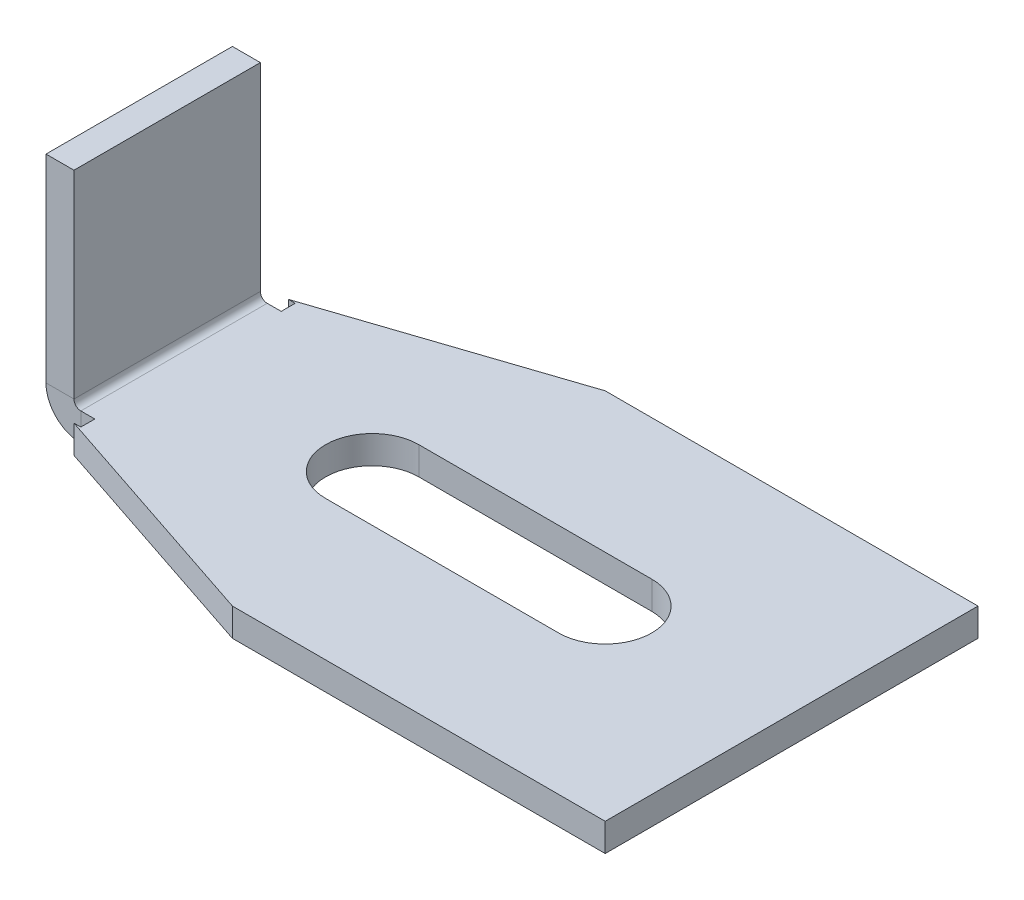
ISO-10303-21;
HEADER;
FILE_DESCRIPTION(('STEP AP214'),'2;1');
FILE_NAME('part.step','',(''),(''),'','','');
FILE_SCHEMA(('AUTOMOTIVE_DESIGN { 1 0 10303 214 1 1 1 1 }'));
ENDSEC;
DATA;
#1=APPLICATION_CONTEXT('core data for automotive mechanical design processes');
#2=APPLICATION_PROTOCOL_DEFINITION('international standard','automotive_design',2000,#1);
#3=PRODUCT_CONTEXT('',#1,'mechanical');
#4=PRODUCT('Part','Part','',(#3));
#5=PRODUCT_RELATED_PRODUCT_CATEGORY('part','',(#4));
#6=PRODUCT_DEFINITION_FORMATION('','',#4);
#7=PRODUCT_DEFINITION_CONTEXT('part definition',#1,'design');
#8=PRODUCT_DEFINITION('design','',#6,#7);
#9=PRODUCT_DEFINITION_SHAPE('','',#8);
#10=(LENGTH_UNIT() NAMED_UNIT(*) SI_UNIT(.MILLI.,.METRE.));
#11=(NAMED_UNIT(*) PLANE_ANGLE_UNIT() SI_UNIT($,.RADIAN.));
#12=(NAMED_UNIT(*) SI_UNIT($,.STERADIAN.) SOLID_ANGLE_UNIT());
#13=UNCERTAINTY_MEASURE_WITH_UNIT(LENGTH_MEASURE(1.E-05),#10,'distance_accuracy_value','');
#14=(GEOMETRIC_REPRESENTATION_CONTEXT(3) GLOBAL_UNCERTAINTY_ASSIGNED_CONTEXT((#13)) GLOBAL_UNIT_ASSIGNED_CONTEXT((#10,
#11,#12)) REPRESENTATION_CONTEXT('',''));
#15=CARTESIAN_POINT('',(0.,0.,0.));
#16=DIRECTION('',(0.,0.,1.));
#17=DIRECTION('',(1.,0.,0.));
#18=AXIS2_PLACEMENT_3D('',#15,#16,#17);
#19=CARTESIAN_POINT('',(30.,-3.,-20.));
#20=DIRECTION('',(-0.316227766016838,0.,-0.948683298050514));
#21=DIRECTION('',(-0.948683298050514,0.,0.316227766016838));
#22=AXIS2_PLACEMENT_3D('',#19,#20,#21);
#23=PLANE('',#22);
#24=DIRECTION('',(-0.948683298050514,0.,0.316227766016838));
#25=VECTOR('',#24,1.);
#26=CARTESIAN_POINT('',(30.,-3.,-20.));
#27=LINE('',#26,#25);
#28=CARTESIAN_POINT('',(30.,-3.,-20.));
#29=VERTEX_POINT('',#28);
#30=CARTESIAN_POINT('',(4.50000000000001,-3.,-11.5));
#31=VERTEX_POINT('',#30);
#32=EDGE_CURVE('E344',#29,#31,#27,.T.);
#33=ORIENTED_EDGE('',*,*,#32,.T.);
#34=DIRECTION('',(0.,-1.,0.));
#35=VECTOR('',#34,1.);
#36=CARTESIAN_POINT('',(4.50000000000001,0.,-11.5));
#37=LINE('',#36,#35);
#38=CARTESIAN_POINT('',(4.50000000000001,0.,-11.5));
#39=VERTEX_POINT('',#38);
#40=EDGE_CURVE('E308',#39,#31,#37,.T.);
#41=ORIENTED_EDGE('',*,*,#40,.F.);
#42=DIRECTION('',(-0.948683298050514,0.,0.316227766016838));
#43=VECTOR('',#42,1.);
#44=CARTESIAN_POINT('',(30.,0.,-20.));
#45=LINE('',#44,#43);
#46=CARTESIAN_POINT('',(30.,0.,-20.));
#47=VERTEX_POINT('',#46);
#48=EDGE_CURVE('E336',#47,#39,#45,.T.);
#49=ORIENTED_EDGE('',*,*,#48,.F.);
#50=DIRECTION('',(0.,1.,0.));
#51=VECTOR('',#50,1.);
#52=CARTESIAN_POINT('',(30.,-3.,-20.));
#53=LINE('',#52,#51);
#54=EDGE_CURVE('E13',#29,#47,#53,.T.);
#55=ORIENTED_EDGE('',*,*,#54,.F.);
#56=EDGE_LOOP('',(#33,#41,#49,#55));
#57=FACE_BOUND('',#56,.T.);
#58=ADVANCED_FACE('F58',(#57),#23,.T.);
#59=CARTESIAN_POINT('',(30.,-3.,20.));
#60=DIRECTION('',(-0.316227766016838,0.,0.948683298050514));
#61=DIRECTION('',(0.948683298050514,0.,0.316227766016838));
#62=AXIS2_PLACEMENT_3D('',#59,#60,#61);
#63=PLANE('',#62);
#64=DIRECTION('',(0.948683298050514,0.,0.316227766016838));
#65=VECTOR('',#64,1.);
#66=CARTESIAN_POINT('',(30.,0.,20.));
#67=LINE('',#66,#65);
#68=CARTESIAN_POINT('',(4.5,0.,11.5));
#69=VERTEX_POINT('',#68);
#70=CARTESIAN_POINT('',(30.,0.,20.));
#71=VERTEX_POINT('',#70);
#72=EDGE_CURVE('E332',#69,#71,#67,.T.);
#73=ORIENTED_EDGE('',*,*,#72,.F.);
#74=DIRECTION('',(0.,-1.,0.));
#75=VECTOR('',#74,1.);
#76=CARTESIAN_POINT('',(4.5,0.,11.5));
#77=LINE('',#76,#75);
#78=CARTESIAN_POINT('',(4.5,-3.,11.5));
#79=VERTEX_POINT('',#78);
#80=EDGE_CURVE('E289',#69,#79,#77,.T.);
#81=ORIENTED_EDGE('',*,*,#80,.T.);
#82=DIRECTION('',(0.948683298050514,0.,0.316227766016838));
#83=VECTOR('',#82,1.);
#84=CARTESIAN_POINT('',(30.,-3.,20.));
#85=LINE('',#84,#83);
#86=CARTESIAN_POINT('',(30.,-3.,20.));
#87=VERTEX_POINT('',#86);
#88=EDGE_CURVE('E333',#79,#87,#85,.T.);
#89=ORIENTED_EDGE('',*,*,#88,.T.);
#90=DIRECTION('',(0.,1.,0.));
#91=VECTOR('',#90,1.);
#92=CARTESIAN_POINT('',(30.,-3.,20.));
#93=LINE('',#92,#91);
#94=EDGE_CURVE('E62',#87,#71,#93,.T.);
#95=ORIENTED_EDGE('',*,*,#94,.T.);
#96=EDGE_LOOP('',(#73,#81,#89,#95));
#97=FACE_BOUND('',#96,.T.);
#98=ADVANCED_FACE('F60',(#97),#63,.T.);
#99=CARTESIAN_POINT('',(0.,-3.,0.));
#100=DIRECTION('',(0.,-1.,0.));
#101=DIRECTION('',(0.,0.,-1.));
#102=AXIS2_PLACEMENT_3D('',#99,#100,#101);
#103=PLANE('',#102);
#104=CARTESIAN_POINT('',(50.,-3.,0.));
#105=DIRECTION('',(0.,-1.,0.));
#106=DIRECTION('',(0.,0.,-1.));
#107=AXIS2_PLACEMENT_3D('',#104,#105,#106);
#108=CIRCLE('',#107,5.);
#109=CARTESIAN_POINT('',(50.,-3.,-5.));
#110=VERTEX_POINT('',#109);
#111=CARTESIAN_POINT('',(50.,-3.,5.));
#112=VERTEX_POINT('',#111);
#113=EDGE_CURVE('E229',#110,#112,#108,.T.);
#114=ORIENTED_EDGE('',*,*,#113,.F.);
#115=DIRECTION('',(1.,0.,0.));
#116=VECTOR('',#115,1.);
#117=CARTESIAN_POINT('',(0.,-3.,-5.));
#118=LINE('',#117,#116);
#119=CARTESIAN_POINT('',(25.,-3.,-5.));
#120=VERTEX_POINT('',#119);
#121=EDGE_CURVE('E222',#120,#110,#118,.T.);
#122=ORIENTED_EDGE('',*,*,#121,.F.);
#123=CARTESIAN_POINT('',(25.,-3.,0.));
#124=DIRECTION('',(0.,-1.,0.));
#125=DIRECTION('',(0.,0.,-1.));
#126=AXIS2_PLACEMENT_3D('',#123,#124,#125);
#127=CIRCLE('',#126,5.);
#128=CARTESIAN_POINT('',(25.,-3.,5.));
#129=VERTEX_POINT('',#128);
#130=EDGE_CURVE('E202',#129,#120,#127,.T.);
#131=ORIENTED_EDGE('',*,*,#130,.F.);
#132=DIRECTION('',(-1.,0.,0.));
#133=VECTOR('',#132,1.);
#134=CARTESIAN_POINT('',(0.,-3.,5.00000000000001));
#135=LINE('',#134,#133);
#136=EDGE_CURVE('E227',#112,#129,#135,.T.);
#137=ORIENTED_EDGE('',*,*,#136,.F.);
#138=EDGE_LOOP('',(#114,#122,#131,#137));
#139=FACE_BOUND('',#138,.T.);
#140=ORIENTED_EDGE('',*,*,#88,.F.);
#141=DIRECTION('',(1.,0.,0.));
#142=VECTOR('',#141,1.);
#143=CARTESIAN_POINT('',(0.,-3.,11.5));
#144=LINE('',#143,#142);
#145=CARTESIAN_POINT('',(5.2366,-3.,11.5));
#146=VERTEX_POINT('',#145);
#147=EDGE_CURVE('E330',#79,#146,#144,.T.);
#148=ORIENTED_EDGE('',*,*,#147,.T.);
#149=DIRECTION('',(0.,0.,-1.));
#150=VECTOR('',#149,1.);
#151=CARTESIAN_POINT('',(5.2366,-3.,0.));
#152=LINE('',#151,#150);
#153=CARTESIAN_POINT('',(5.2366,-3.,10.));
#154=VERTEX_POINT('',#153);
#155=EDGE_CURVE('E328',#146,#154,#152,.T.);
#156=ORIENTED_EDGE('',*,*,#155,.T.);
#157=DIRECTION('',(-1.,0.,0.));
#158=VECTOR('',#157,1.);
#159=CARTESIAN_POINT('',(0.,-3.,10.));
#160=LINE('',#159,#158);
#161=CARTESIAN_POINT('',(3.7366,-3.,10.));
#162=VERTEX_POINT('',#161);
#163=EDGE_CURVE('E325',#154,#162,#160,.T.);
#164=ORIENTED_EDGE('',*,*,#163,.T.);
#165=DIRECTION('',(0.,0.,1.));
#166=VECTOR('',#165,1.);
#167=CARTESIAN_POINT('',(3.7366,-3.,10.));
#168=LINE('',#167,#166);
#169=CARTESIAN_POINT('',(3.7366,-3.,-10.));
#170=VERTEX_POINT('',#169);
#171=EDGE_CURVE('E262',#162,#170,#168,.F.);
#172=ORIENTED_EDGE('',*,*,#171,.T.);
#173=DIRECTION('',(1.,0.,0.));
#174=VECTOR('',#173,1.);
#175=CARTESIAN_POINT('',(0.,-3.,-10.));
#176=LINE('',#175,#174);
#177=CARTESIAN_POINT('',(5.2366,-3.,-10.));
#178=VERTEX_POINT('',#177);
#179=EDGE_CURVE('E323',#170,#178,#176,.T.);
#180=ORIENTED_EDGE('',*,*,#179,.T.);
#181=DIRECTION('',(0.,0.,-1.));
#182=VECTOR('',#181,1.);
#183=CARTESIAN_POINT('',(5.2366,-3.,0.));
#184=LINE('',#183,#182);
#185=CARTESIAN_POINT('',(5.2366,-3.,-11.5));
#186=VERTEX_POINT('',#185);
#187=EDGE_CURVE('E321',#178,#186,#184,.T.);
#188=ORIENTED_EDGE('',*,*,#187,.T.);
#189=DIRECTION('',(-1.,0.,0.));
#190=VECTOR('',#189,1.);
#191=CARTESIAN_POINT('',(0.,-3.,-11.5));
#192=LINE('',#191,#190);
#193=EDGE_CURVE('E288',#186,#31,#192,.T.);
#194=ORIENTED_EDGE('',*,*,#193,.T.);
#195=ORIENTED_EDGE('',*,*,#32,.F.);
#196=DIRECTION('',(-1.,0.,0.));
#197=VECTOR('',#196,1.);
#198=CARTESIAN_POINT('',(70.,-3.,-20.));
#199=LINE('',#198,#197);
#200=CARTESIAN_POINT('',(70.,-3.,-20.));
#201=VERTEX_POINT('',#200);
#202=EDGE_CURVE('E341',#201,#29,#199,.T.);
#203=ORIENTED_EDGE('',*,*,#202,.F.);
#204=DIRECTION('',(0.,0.,-1.));
#205=VECTOR('',#204,1.);
#206=CARTESIAN_POINT('',(70.,-3.,0.));
#207=LINE('',#206,#205);
#208=CARTESIAN_POINT('',(70.,-3.,20.));
#209=VERTEX_POINT('',#208);
#210=EDGE_CURVE('E339',#209,#201,#207,.T.);
#211=ORIENTED_EDGE('',*,*,#210,.F.);
#212=DIRECTION('',(1.,0.,0.));
#213=VECTOR('',#212,1.);
#214=CARTESIAN_POINT('',(70.,-3.,20.));
#215=LINE('',#214,#213);
#216=EDGE_CURVE('E335',#87,#209,#215,.T.);
#217=ORIENTED_EDGE('',*,*,#216,.F.);
#218=EDGE_LOOP('',(#140,#148,#156,#164,#172,#180,#188,#194,#195,#203,#211,#217));
#219=FACE_BOUND('',#218,.T.);
#220=ADVANCED_FACE('F375',(#139,#219),#103,.T.);
#221=CARTESIAN_POINT('',(0.,0.,0.));
#222=DIRECTION('',(0.,-1.,0.));
#223=DIRECTION('',(0.,0.,-1.));
#224=AXIS2_PLACEMENT_3D('',#221,#222,#223);
#225=PLANE('',#224);
#226=DIRECTION('',(-1.,0.,0.));
#227=VECTOR('',#226,1.);
#228=CARTESIAN_POINT('',(50.,0.,-5.));
#229=LINE('',#228,#227);
#230=CARTESIAN_POINT('',(50.,0.,-5.));
#231=VERTEX_POINT('',#230);
#232=CARTESIAN_POINT('',(25.,0.,-5.));
#233=VERTEX_POINT('',#232);
#234=EDGE_CURVE('E208',#231,#233,#229,.T.);
#235=ORIENTED_EDGE('',*,*,#234,.F.);
#236=CARTESIAN_POINT('',(50.,0.,0.));
#237=DIRECTION('',(0.,1.,0.));
#238=DIRECTION('',(0.,0.,1.));
#239=AXIS2_PLACEMENT_3D('',#236,#237,#238);
#240=CIRCLE('',#239,5.);
#241=CARTESIAN_POINT('',(50.,0.,5.));
#242=VERTEX_POINT('',#241);
#243=EDGE_CURVE('E83',#242,#231,#240,.T.);
#244=ORIENTED_EDGE('',*,*,#243,.F.);
#245=DIRECTION('',(1.,0.,0.));
#246=VECTOR('',#245,1.);
#247=CARTESIAN_POINT('',(50.,0.,5.));
#248=LINE('',#247,#246);
#249=CARTESIAN_POINT('',(25.,0.,5.));
#250=VERTEX_POINT('',#249);
#251=EDGE_CURVE('E215',#250,#242,#248,.T.);
#252=ORIENTED_EDGE('',*,*,#251,.F.);
#253=CARTESIAN_POINT('',(25.,0.,0.));
#254=DIRECTION('',(0.,1.,0.));
#255=DIRECTION('',(0.,0.,1.));
#256=AXIS2_PLACEMENT_3D('',#253,#254,#255);
#257=CIRCLE('',#256,5.);
#258=EDGE_CURVE('E199',#233,#250,#257,.T.);
#259=ORIENTED_EDGE('',*,*,#258,.F.);
#260=EDGE_LOOP('',(#235,#244,#252,#259));
#261=FACE_BOUND('',#260,.T.);
#262=DIRECTION('',(1.,0.,0.));
#263=VECTOR('',#262,1.);
#264=CARTESIAN_POINT('',(4.5,0.,11.5));
#265=LINE('',#264,#263);
#266=CARTESIAN_POINT('',(5.2366,0.,11.5));
#267=VERTEX_POINT('',#266);
#268=EDGE_CURVE('E285',#69,#267,#265,.T.);
#269=ORIENTED_EDGE('',*,*,#268,.F.);
#270=ORIENTED_EDGE('',*,*,#72,.T.);
#271=DIRECTION('',(1.,0.,0.));
#272=VECTOR('',#271,1.);
#273=CARTESIAN_POINT('',(70.,0.,20.));
#274=LINE('',#273,#272);
#275=CARTESIAN_POINT('',(70.,0.,20.));
#276=VERTEX_POINT('',#275);
#277=EDGE_CURVE('E348',#71,#276,#274,.T.);
#278=ORIENTED_EDGE('',*,*,#277,.T.);
#279=DIRECTION('',(0.,0.,-1.));
#280=VECTOR('',#279,1.);
#281=CARTESIAN_POINT('',(70.,0.,0.));
#282=LINE('',#281,#280);
#283=CARTESIAN_POINT('',(70.,0.,-20.));
#284=VERTEX_POINT('',#283);
#285=EDGE_CURVE('E351',#276,#284,#282,.T.);
#286=ORIENTED_EDGE('',*,*,#285,.T.);
#287=DIRECTION('',(-1.,0.,0.));
#288=VECTOR('',#287,1.);
#289=CARTESIAN_POINT('',(70.,0.,-20.));
#290=LINE('',#289,#288);
#291=EDGE_CURVE('E354',#284,#47,#290,.T.);
#292=ORIENTED_EDGE('',*,*,#291,.T.);
#293=ORIENTED_EDGE('',*,*,#48,.T.);
#294=DIRECTION('',(-1.,0.,0.));
#295=VECTOR('',#294,1.);
#296=CARTESIAN_POINT('',(5.2366,0.,-11.5));
#297=LINE('',#296,#295);
#298=CARTESIAN_POINT('',(5.2366,0.,-11.5));
#299=VERTEX_POINT('',#298);
#300=EDGE_CURVE('E305',#299,#39,#297,.T.);
#301=ORIENTED_EDGE('',*,*,#300,.F.);
#302=DIRECTION('',(0.,0.,-1.));
#303=VECTOR('',#302,1.);
#304=CARTESIAN_POINT('',(5.2366,0.,-10.));
#305=LINE('',#304,#303);
#306=CARTESIAN_POINT('',(5.2366,0.,-10.));
#307=VERTEX_POINT('',#306);
#308=EDGE_CURVE('E301',#307,#299,#305,.T.);
#309=ORIENTED_EDGE('',*,*,#308,.F.);
#310=DIRECTION('',(1.,0.,0.));
#311=VECTOR('',#310,1.);
#312=CARTESIAN_POINT('',(3.7366,0.,-10.));
#313=LINE('',#312,#311);
#314=CARTESIAN_POINT('',(3.7366,0.,-10.));
#315=VERTEX_POINT('',#314);
#316=EDGE_CURVE('E298',#315,#307,#313,.T.);
#317=ORIENTED_EDGE('',*,*,#316,.F.);
#318=DIRECTION('',(0.,0.,1.));
#319=VECTOR('',#318,1.);
#320=CARTESIAN_POINT('',(3.7366,0.,10.));
#321=LINE('',#320,#319);
#322=CARTESIAN_POINT('',(3.7366,0.,10.));
#323=VERTEX_POINT('',#322);
#324=EDGE_CURVE('E275',#323,#315,#321,.F.);
#325=ORIENTED_EDGE('',*,*,#324,.F.);
#326=DIRECTION('',(-1.,0.,0.));
#327=VECTOR('',#326,1.);
#328=CARTESIAN_POINT('',(5.2366,0.,10.));
#329=LINE('',#328,#327);
#330=CARTESIAN_POINT('',(5.2366,0.,10.));
#331=VERTEX_POINT('',#330);
#332=EDGE_CURVE('E294',#331,#323,#329,.T.);
#333=ORIENTED_EDGE('',*,*,#332,.F.);
#334=DIRECTION('',(0.,0.,-1.));
#335=VECTOR('',#334,1.);
#336=CARTESIAN_POINT('',(5.2366,0.,11.5));
#337=LINE('',#336,#335);
#338=EDGE_CURVE('E290',#267,#331,#337,.T.);
#339=ORIENTED_EDGE('',*,*,#338,.F.);
#340=EDGE_LOOP('',(#269,#270,#278,#286,#292,#293,#301,#309,#317,#325,#333,#339));
#341=FACE_BOUND('',#340,.T.);
#342=ADVANCED_FACE('F212',(#261,#341),#225,.F.);
#343=CARTESIAN_POINT('',(70.,-3.,-20.));
#344=DIRECTION('',(0.,0.,-1.));
#345=DIRECTION('',(-1.,0.,0.));
#346=AXIS2_PLACEMENT_3D('',#343,#344,#345);
#347=PLANE('',#346);
#348=ORIENTED_EDGE('',*,*,#291,.F.);
#349=DIRECTION('',(0.,1.,0.));
#350=VECTOR('',#349,1.);
#351=CARTESIAN_POINT('',(70.,-3.,-20.));
#352=LINE('',#351,#350);
#353=EDGE_CURVE('E67',#201,#284,#352,.T.);
#354=ORIENTED_EDGE('',*,*,#353,.F.);
#355=ORIENTED_EDGE('',*,*,#202,.T.);
#356=ORIENTED_EDGE('',*,*,#54,.T.);
#357=EDGE_LOOP('',(#348,#354,#355,#356));
#358=FACE_BOUND('',#357,.T.);
#359=ADVANCED_FACE('F385',(#358),#347,.T.);
#360=CARTESIAN_POINT('',(70.,-3.,0.));
#361=DIRECTION('',(1.,0.,0.));
#362=DIRECTION('',(0.,0.,-1.));
#363=AXIS2_PLACEMENT_3D('',#360,#361,#362);
#364=PLANE('',#363);
#365=ORIENTED_EDGE('',*,*,#285,.F.);
#366=DIRECTION('',(0.,1.,0.));
#367=VECTOR('',#366,1.);
#368=CARTESIAN_POINT('',(70.,-3.,20.));
#369=LINE('',#368,#367);
#370=EDGE_CURVE('E358',#209,#276,#369,.T.);
#371=ORIENTED_EDGE('',*,*,#370,.F.);
#372=ORIENTED_EDGE('',*,*,#210,.T.);
#373=ORIENTED_EDGE('',*,*,#353,.T.);
#374=EDGE_LOOP('',(#365,#371,#372,#373));
#375=FACE_BOUND('',#374,.T.);
#376=ADVANCED_FACE('F382',(#375),#364,.T.);
#377=CARTESIAN_POINT('',(70.,-3.,20.));
#378=DIRECTION('',(0.,0.,1.));
#379=DIRECTION('',(1.,0.,0.));
#380=AXIS2_PLACEMENT_3D('',#377,#378,#379);
#381=PLANE('',#380);
#382=ORIENTED_EDGE('',*,*,#277,.F.);
#383=ORIENTED_EDGE('',*,*,#94,.F.);
#384=ORIENTED_EDGE('',*,*,#216,.T.);
#385=ORIENTED_EDGE('',*,*,#370,.T.);
#386=EDGE_LOOP('',(#382,#383,#384,#385));
#387=FACE_BOUND('',#386,.T.);
#388=ADVANCED_FACE('F369',(#387),#381,.T.);
#389=CARTESIAN_POINT('',(4.5,0.,11.5));
#390=DIRECTION('',(0.,0.,-1.));
#391=DIRECTION('',(0.,1.,0.));
#392=AXIS2_PLACEMENT_3D('',#389,#390,#391);
#393=PLANE('',#392);
#394=ORIENTED_EDGE('',*,*,#147,.F.);
#395=ORIENTED_EDGE('',*,*,#80,.F.);
#396=ORIENTED_EDGE('',*,*,#268,.T.);
#397=DIRECTION('',(0.,-1.,0.));
#398=VECTOR('',#397,1.);
#399=CARTESIAN_POINT('',(5.2366,0.,11.5));
#400=LINE('',#399,#398);
#401=EDGE_CURVE('E293',#267,#146,#400,.T.);
#402=ORIENTED_EDGE('',*,*,#401,.T.);
#403=EDGE_LOOP('',(#394,#395,#396,#402));
#404=FACE_BOUND('',#403,.T.);
#405=ADVANCED_FACE('F373',(#404),#393,.T.);
#406=CARTESIAN_POINT('',(5.2366,0.,11.5));
#407=DIRECTION('',(-1.,0.,0.));
#408=DIRECTION('',(0.,0.,1.));
#409=AXIS2_PLACEMENT_3D('',#406,#407,#408);
#410=PLANE('',#409);
#411=ORIENTED_EDGE('',*,*,#155,.F.);
#412=ORIENTED_EDGE('',*,*,#401,.F.);
#413=ORIENTED_EDGE('',*,*,#338,.T.);
#414=DIRECTION('',(0.,-1.,0.));
#415=VECTOR('',#414,1.);
#416=CARTESIAN_POINT('',(5.2366,0.,10.));
#417=LINE('',#416,#415);
#418=EDGE_CURVE('E297',#331,#154,#417,.T.);
#419=ORIENTED_EDGE('',*,*,#418,.T.);
#420=EDGE_LOOP('',(#411,#412,#413,#419));
#421=FACE_BOUND('',#420,.T.);
#422=ADVANCED_FACE('F460',(#421),#410,.T.);
#423=CARTESIAN_POINT('',(5.2366,0.,10.));
#424=DIRECTION('',(0.,0.,1.));
#425=DIRECTION('',(0.,-1.,0.));
#426=AXIS2_PLACEMENT_3D('',#423,#424,#425);
#427=PLANE('',#426);
#428=ORIENTED_EDGE('',*,*,#163,.F.);
#429=ORIENTED_EDGE('',*,*,#418,.F.);
#430=ORIENTED_EDGE('',*,*,#332,.T.);
#431=DIRECTION('',(0.,-1.,0.));
#432=VECTOR('',#431,1.);
#433=CARTESIAN_POINT('',(3.7366,0.,10.));
#434=LINE('',#433,#432);
#435=EDGE_CURVE('E269',#323,#162,#434,.T.);
#436=ORIENTED_EDGE('',*,*,#435,.T.);
#437=EDGE_LOOP('',(#428,#429,#430,#436));
#438=FACE_BOUND('',#437,.T.);
#439=ADVANCED_FACE('F465',(#438),#427,.T.);
#440=CARTESIAN_POINT('',(3.7366,0.,-10.));
#441=DIRECTION('',(0.,0.,-1.));
#442=DIRECTION('',(0.,1.,0.));
#443=AXIS2_PLACEMENT_3D('',#440,#441,#442);
#444=PLANE('',#443);
#445=ORIENTED_EDGE('',*,*,#179,.F.);
#446=DIRECTION('',(0.,-1.,0.));
#447=VECTOR('',#446,1.);
#448=CARTESIAN_POINT('',(3.7366,0.,-10.));
#449=LINE('',#448,#447);
#450=EDGE_CURVE('E279',#315,#170,#449,.T.);
#451=ORIENTED_EDGE('',*,*,#450,.F.);
#452=ORIENTED_EDGE('',*,*,#316,.T.);
#453=DIRECTION('',(0.,-1.,0.));
#454=VECTOR('',#453,1.);
#455=CARTESIAN_POINT('',(5.2366,0.,-10.));
#456=LINE('',#455,#454);
#457=EDGE_CURVE('E304',#307,#178,#456,.T.);
#458=ORIENTED_EDGE('',*,*,#457,.T.);
#459=EDGE_LOOP('',(#445,#451,#452,#458));
#460=FACE_BOUND('',#459,.T.);
#461=ADVANCED_FACE('F402',(#460),#444,.T.);
#462=CARTESIAN_POINT('',(5.2366,0.,-10.));
#463=DIRECTION('',(-1.,0.,0.));
#464=DIRECTION('',(0.,0.,1.));
#465=AXIS2_PLACEMENT_3D('',#462,#463,#464);
#466=PLANE('',#465);
#467=ORIENTED_EDGE('',*,*,#187,.F.);
#468=ORIENTED_EDGE('',*,*,#457,.F.);
#469=ORIENTED_EDGE('',*,*,#308,.T.);
#470=DIRECTION('',(0.,-1.,0.));
#471=VECTOR('',#470,1.);
#472=CARTESIAN_POINT('',(5.2366,0.,-11.5));
#473=LINE('',#472,#471);
#474=EDGE_CURVE('E282',#299,#186,#473,.T.);
#475=ORIENTED_EDGE('',*,*,#474,.T.);
#476=EDGE_LOOP('',(#467,#468,#469,#475));
#477=FACE_BOUND('',#476,.T.);
#478=ADVANCED_FACE('F396',(#477),#466,.T.);
#479=CARTESIAN_POINT('',(5.2366,0.,-11.5));
#480=DIRECTION('',(0.,0.,1.));
#481=DIRECTION('',(1.,0.,0.));
#482=AXIS2_PLACEMENT_3D('',#479,#480,#481);
#483=PLANE('',#482);
#484=ORIENTED_EDGE('',*,*,#193,.F.);
#485=ORIENTED_EDGE('',*,*,#474,.F.);
#486=ORIENTED_EDGE('',*,*,#300,.T.);
#487=ORIENTED_EDGE('',*,*,#40,.T.);
#488=EDGE_LOOP('',(#484,#485,#486,#487));
#489=FACE_BOUND('',#488,.T.);
#490=ADVANCED_FACE('F392',(#489),#483,.T.);
#491=CARTESIAN_POINT('',(3.7366,0.7366,-10.));
#492=DIRECTION('',(0.,0.,-1.));
#493=DIRECTION('',(0.,1.,0.));
#494=AXIS2_PLACEMENT_3D('',#491,#492,#493);
#495=PLANE('',#494);
#496=DIRECTION('',(1.,0.,0.));
#497=VECTOR('',#496,1.);
#498=CARTESIAN_POINT('',(0.,0.736599999999987,-10.));
#499=LINE('',#498,#497);
#500=CARTESIAN_POINT('',(3.,0.736599999999997,-10.));
#501=VERTEX_POINT('',#500);
#502=CARTESIAN_POINT('',(0.,0.736599999999987,-10.));
#503=VERTEX_POINT('',#502);
#504=EDGE_CURVE('E231',#501,#503,#499,.F.);
#505=ORIENTED_EDGE('',*,*,#504,.F.);
#506=CARTESIAN_POINT('',(3.7366,0.7366,-10.));
#507=DIRECTION('',(0.,0.,1.));
#508=DIRECTION('',(0.,-1.,0.));
#509=AXIS2_PLACEMENT_3D('',#506,#507,#508);
#510=CIRCLE('',#509,0.736600000000001);
#511=EDGE_CURVE('E272',#315,#501,#510,.F.);
#512=ORIENTED_EDGE('',*,*,#511,.F.);
#513=ORIENTED_EDGE('',*,*,#450,.T.);
#514=CARTESIAN_POINT('',(3.7366,0.7366,-10.));
#515=DIRECTION('',(0.,0.,1.));
#516=DIRECTION('',(0.,-1.,0.));
#517=AXIS2_PLACEMENT_3D('',#514,#515,#516);
#518=CIRCLE('',#517,3.7366);
#519=EDGE_CURVE('E265',#170,#503,#518,.F.);
#520=ORIENTED_EDGE('',*,*,#519,.T.);
#521=EDGE_LOOP('',(#505,#512,#513,#520));
#522=FACE_BOUND('',#521,.T.);
#523=ADVANCED_FACE('F405',(#522),#495,.T.);
#524=CARTESIAN_POINT('',(3.7366,0.736599999999999,10.));
#525=DIRECTION('',(0.,0.,-1.));
#526=DIRECTION('',(0.,1.,0.));
#527=AXIS2_PLACEMENT_3D('',#524,#525,#526);
#528=PLANE('',#527);
#529=CARTESIAN_POINT('',(3.7366,0.736599999999999,10.));
#530=DIRECTION('',(0.,0.,1.));
#531=DIRECTION('',(0.,-1.,0.));
#532=AXIS2_PLACEMENT_3D('',#529,#530,#531);
#533=CIRCLE('',#532,0.736600000000001);
#534=CARTESIAN_POINT('',(3.,0.736599999999996,10.));
#535=VERTEX_POINT('',#534);
#536=EDGE_CURVE('E235',#535,#323,#533,.T.);
#537=ORIENTED_EDGE('',*,*,#536,.F.);
#538=DIRECTION('',(1.,0.,0.));
#539=VECTOR('',#538,1.);
#540=CARTESIAN_POINT('',(3.,0.736599999999996,10.));
#541=LINE('',#540,#539);
#542=CARTESIAN_POINT('',(0.,0.736599999999986,10.));
#543=VERTEX_POINT('',#542);
#544=EDGE_CURVE('E255',#535,#543,#541,.F.);
#545=ORIENTED_EDGE('',*,*,#544,.T.);
#546=CARTESIAN_POINT('',(3.7366,0.736599999999999,10.));
#547=DIRECTION('',(0.,0.,1.));
#548=DIRECTION('',(0.,-1.,0.));
#549=AXIS2_PLACEMENT_3D('',#546,#547,#548);
#550=CIRCLE('',#549,3.7366);
#551=EDGE_CURVE('E266',#543,#162,#550,.T.);
#552=ORIENTED_EDGE('',*,*,#551,.T.);
#553=ORIENTED_EDGE('',*,*,#435,.F.);
#554=EDGE_LOOP('',(#537,#545,#552,#553));
#555=FACE_BOUND('',#554,.T.);
#556=ADVANCED_FACE('F411',(#555),#528,.F.);
#557=CARTESIAN_POINT('',(3.7366,0.736599999999999,10.));
#558=DIRECTION('',(0.,0.,1.));
#559=DIRECTION('',(-1.,0.,0.));
#560=AXIS2_PLACEMENT_3D('',#557,#558,#559);
#561=CYLINDRICAL_SURFACE('',#560,3.7366);
#562=ORIENTED_EDGE('',*,*,#171,.F.);
#563=ORIENTED_EDGE('',*,*,#551,.F.);
#564=DIRECTION('',(0.,0.,1.));
#565=VECTOR('',#564,1.);
#566=CARTESIAN_POINT('',(0.,0.736599999999987,-10.));
#567=LINE('',#566,#565);
#568=EDGE_CURVE('E253',#543,#503,#567,.F.);
#569=ORIENTED_EDGE('',*,*,#568,.T.);
#570=ORIENTED_EDGE('',*,*,#519,.F.);
#571=EDGE_LOOP('',(#562,#563,#569,#570));
#572=FACE_BOUND('',#571,.T.);
#573=ADVANCED_FACE('F408',(#572),#561,.T.);
#574=CARTESIAN_POINT('',(3.7366,0.736599999999999,10.));
#575=DIRECTION('',(0.,0.,1.));
#576=DIRECTION('',(-1.,0.,0.));
#577=AXIS2_PLACEMENT_3D('',#574,#575,#576);
#578=CYLINDRICAL_SURFACE('',#577,0.736600000000001);
#579=ORIENTED_EDGE('',*,*,#324,.T.);
#580=ORIENTED_EDGE('',*,*,#511,.T.);
#581=DIRECTION('',(0.,0.,1.));
#582=VECTOR('',#581,1.);
#583=CARTESIAN_POINT('',(3.,0.736599999999997,-10.));
#584=LINE('',#583,#582);
#585=EDGE_CURVE('E258',#501,#535,#584,.T.);
#586=ORIENTED_EDGE('',*,*,#585,.T.);
#587=ORIENTED_EDGE('',*,*,#536,.T.);
#588=EDGE_LOOP('',(#579,#580,#586,#587));
#589=FACE_BOUND('',#588,.T.);
#590=ADVANCED_FACE('F432',(#589),#578,.F.);
#591=CARTESIAN_POINT('',(0.,22.,10.));
#592=DIRECTION('',(0.,0.,-1.));
#593=DIRECTION('',(-1.,0.,0.));
#594=AXIS2_PLACEMENT_3D('',#591,#592,#593);
#595=PLANE('',#594);
#596=ORIENTED_EDGE('',*,*,#544,.F.);
#597=DIRECTION('',(0.,-1.,0.));
#598=VECTOR('',#597,1.);
#599=CARTESIAN_POINT('',(2.99999999999992,22.,10.));
#600=LINE('',#599,#598);
#601=CARTESIAN_POINT('',(2.99999999999992,22.,10.));
#602=VERTEX_POINT('',#601);
#603=EDGE_CURVE('E251',#535,#602,#600,.F.);
#604=ORIENTED_EDGE('',*,*,#603,.T.);
#605=DIRECTION('',(1.,0.,0.));
#606=VECTOR('',#605,1.);
#607=CARTESIAN_POINT('',(0.,22.,10.));
#608=LINE('',#607,#606);
#609=CARTESIAN_POINT('',(0.,22.,10.));
#610=VERTEX_POINT('',#609);
#611=EDGE_CURVE('E232',#610,#602,#608,.T.);
#612=ORIENTED_EDGE('',*,*,#611,.F.);
#613=DIRECTION('',(0.,1.,0.));
#614=VECTOR('',#613,1.);
#615=CARTESIAN_POINT('',(0.,0.,10.));
#616=LINE('',#615,#614);
#617=EDGE_CURVE('E244',#543,#610,#616,.T.);
#618=ORIENTED_EDGE('',*,*,#617,.F.);
#619=EDGE_LOOP('',(#596,#604,#612,#618));
#620=FACE_BOUND('',#619,.T.);
#621=ADVANCED_FACE('F421',(#620),#595,.F.);
#622=CARTESIAN_POINT('',(0.,0.,-10.));
#623=DIRECTION('',(0.,0.,1.));
#624=DIRECTION('',(1.,0.,0.));
#625=AXIS2_PLACEMENT_3D('',#622,#623,#624);
#626=PLANE('',#625);
#627=ORIENTED_EDGE('',*,*,#504,.T.);
#628=DIRECTION('',(0.,-1.,0.));
#629=VECTOR('',#628,1.);
#630=CARTESIAN_POINT('',(0.,0.,-10.));
#631=LINE('',#630,#629);
#632=CARTESIAN_POINT('',(0.,22.,-10.));
#633=VERTEX_POINT('',#632);
#634=EDGE_CURVE('E239',#633,#503,#631,.T.);
#635=ORIENTED_EDGE('',*,*,#634,.F.);
#636=DIRECTION('',(1.,0.,0.));
#637=VECTOR('',#636,1.);
#638=CARTESIAN_POINT('',(0.,22.,-10.));
#639=LINE('',#638,#637);
#640=CARTESIAN_POINT('',(2.99999999999992,22.,-10.));
#641=VERTEX_POINT('',#640);
#642=EDGE_CURVE('E236',#633,#641,#639,.T.);
#643=ORIENTED_EDGE('',*,*,#642,.T.);
#644=DIRECTION('',(0.,1.,0.));
#645=VECTOR('',#644,1.);
#646=CARTESIAN_POINT('',(3.,0.,-10.));
#647=LINE('',#646,#645);
#648=EDGE_CURVE('E246',#641,#501,#647,.F.);
#649=ORIENTED_EDGE('',*,*,#648,.T.);
#650=EDGE_LOOP('',(#627,#635,#643,#649));
#651=FACE_BOUND('',#650,.T.);
#652=ADVANCED_FACE('F429',(#651),#626,.F.);
#653=CARTESIAN_POINT('',(0.,0.,0.));
#654=DIRECTION('',(1.,0.,0.));
#655=DIRECTION('',(0.,1.,0.));
#656=AXIS2_PLACEMENT_3D('',#653,#654,#655);
#657=PLANE('',#656);
#658=ORIENTED_EDGE('',*,*,#568,.F.);
#659=ORIENTED_EDGE('',*,*,#617,.T.);
#660=DIRECTION('',(0.,0.,-1.));
#661=VECTOR('',#660,1.);
#662=CARTESIAN_POINT('',(0.,22.,0.));
#663=LINE('',#662,#661);
#664=EDGE_CURVE('E242',#610,#633,#663,.T.);
#665=ORIENTED_EDGE('',*,*,#664,.T.);
#666=ORIENTED_EDGE('',*,*,#634,.T.);
#667=EDGE_LOOP('',(#658,#659,#665,#666));
#668=FACE_BOUND('',#667,.T.);
#669=ADVANCED_FACE('F418',(#668),#657,.F.);
#670=CARTESIAN_POINT('',(3.,0.,0.));
#671=DIRECTION('',(1.,0.,0.));
#672=DIRECTION('',(0.,1.,0.));
#673=AXIS2_PLACEMENT_3D('',#670,#671,#672);
#674=PLANE('',#673);
#675=ORIENTED_EDGE('',*,*,#603,.F.);
#676=ORIENTED_EDGE('',*,*,#585,.F.);
#677=ORIENTED_EDGE('',*,*,#648,.F.);
#678=DIRECTION('',(0.,0.,1.));
#679=VECTOR('',#678,1.);
#680=CARTESIAN_POINT('',(2.99999999999992,22.,-10.));
#681=LINE('',#680,#679);
#682=EDGE_CURVE('E249',#602,#641,#681,.F.);
#683=ORIENTED_EDGE('',*,*,#682,.F.);
#684=EDGE_LOOP('',(#675,#676,#677,#683));
#685=FACE_BOUND('',#684,.T.);
#686=ADVANCED_FACE('F434',(#685),#674,.T.);
#687=CARTESIAN_POINT('',(0.,22.,-10.));
#688=DIRECTION('',(0.,-1.,0.));
#689=DIRECTION('',(1.,0.,0.));
#690=AXIS2_PLACEMENT_3D('',#687,#688,#689);
#691=PLANE('',#690);
#692=ORIENTED_EDGE('',*,*,#682,.T.);
#693=ORIENTED_EDGE('',*,*,#642,.F.);
#694=ORIENTED_EDGE('',*,*,#664,.F.);
#695=ORIENTED_EDGE('',*,*,#611,.T.);
#696=EDGE_LOOP('',(#692,#693,#694,#695));
#697=FACE_BOUND('',#696,.T.);
#698=ADVANCED_FACE('F426',(#697),#691,.F.);
#699=CARTESIAN_POINT('',(50.,-10.,0.));
#700=DIRECTION('',(0.,1.,0.));
#701=DIRECTION('',(0.,0.,1.));
#702=AXIS2_PLACEMENT_3D('',#699,#700,#701);
#703=CYLINDRICAL_SURFACE('',#702,5.);
#704=ORIENTED_EDGE('',*,*,#113,.T.);
#705=DIRECTION('',(0.,1.,0.));
#706=VECTOR('',#705,1.);
#707=CARTESIAN_POINT('',(50.,-10.,5.));
#708=LINE('',#707,#706);
#709=EDGE_CURVE('E220',#112,#242,#708,.T.);
#710=ORIENTED_EDGE('',*,*,#709,.T.);
#711=ORIENTED_EDGE('',*,*,#243,.T.);
#712=DIRECTION('',(0.,1.,0.));
#713=VECTOR('',#712,1.);
#714=CARTESIAN_POINT('',(50.,-10.,-5.));
#715=LINE('',#714,#713);
#716=EDGE_CURVE('E205',#110,#231,#715,.T.);
#717=ORIENTED_EDGE('',*,*,#716,.F.);
#718=EDGE_LOOP('',(#704,#710,#711,#717));
#719=FACE_BOUND('',#718,.T.);
#720=ADVANCED_FACE('F441',(#719),#703,.F.);
#721=CARTESIAN_POINT('',(50.,-10.,5.));
#722=DIRECTION('',(0.,0.,1.));
#723=DIRECTION('',(1.,0.,0.));
#724=AXIS2_PLACEMENT_3D('',#721,#722,#723);
#725=PLANE('',#724);
#726=ORIENTED_EDGE('',*,*,#136,.T.);
#727=DIRECTION('',(0.,1.,0.));
#728=VECTOR('',#727,1.);
#729=CARTESIAN_POINT('',(25.,-10.,5.));
#730=LINE('',#729,#728);
#731=EDGE_CURVE('E204',#129,#250,#730,.T.);
#732=ORIENTED_EDGE('',*,*,#731,.T.);
#733=ORIENTED_EDGE('',*,*,#251,.T.);
#734=ORIENTED_EDGE('',*,*,#709,.F.);
#735=EDGE_LOOP('',(#726,#732,#733,#734));
#736=FACE_BOUND('',#735,.T.);
#737=ADVANCED_FACE('F478',(#736),#725,.F.);
#738=CARTESIAN_POINT('',(25.,-10.,0.));
#739=DIRECTION('',(0.,1.,0.));
#740=DIRECTION('',(0.,0.,1.));
#741=AXIS2_PLACEMENT_3D('',#738,#739,#740);
#742=CYLINDRICAL_SURFACE('',#741,5.);
#743=ORIENTED_EDGE('',*,*,#130,.T.);
#744=DIRECTION('',(0.,1.,0.));
#745=VECTOR('',#744,1.);
#746=CARTESIAN_POINT('',(25.,-10.,-5.));
#747=LINE('',#746,#745);
#748=EDGE_CURVE('E75',#120,#233,#747,.T.);
#749=ORIENTED_EDGE('',*,*,#748,.T.);
#750=ORIENTED_EDGE('',*,*,#258,.T.);
#751=ORIENTED_EDGE('',*,*,#731,.F.);
#752=EDGE_LOOP('',(#743,#749,#750,#751));
#753=FACE_BOUND('',#752,.T.);
#754=ADVANCED_FACE('F196',(#753),#742,.F.);
#755=CARTESIAN_POINT('',(50.,-10.,-5.));
#756=DIRECTION('',(0.,0.,-1.));
#757=DIRECTION('',(-1.,0.,0.));
#758=AXIS2_PLACEMENT_3D('',#755,#756,#757);
#759=PLANE('',#758);
#760=ORIENTED_EDGE('',*,*,#121,.T.);
#761=ORIENTED_EDGE('',*,*,#716,.T.);
#762=ORIENTED_EDGE('',*,*,#234,.T.);
#763=ORIENTED_EDGE('',*,*,#748,.F.);
#764=EDGE_LOOP('',(#760,#761,#762,#763));
#765=FACE_BOUND('',#764,.T.);
#766=ADVANCED_FACE('F209',(#765),#759,.F.);
#767=CLOSED_SHELL('',(#58,#98,#220,#342,#359,#376,#388,#405,#422,#439,#461,#478,#490,#523,#556,
#573,#590,#621,#652,#669,#686,#698,#720,#737,#754,#766));
#768=MANIFOLD_SOLID_BREP('B2',#767);
#769=ADVANCED_BREP_SHAPE_REPRESENTATION('',(#18,#768),#14);
#770=SHAPE_DEFINITION_REPRESENTATION(#9,#769);
ENDSEC;
END-ISO-10303-21;
